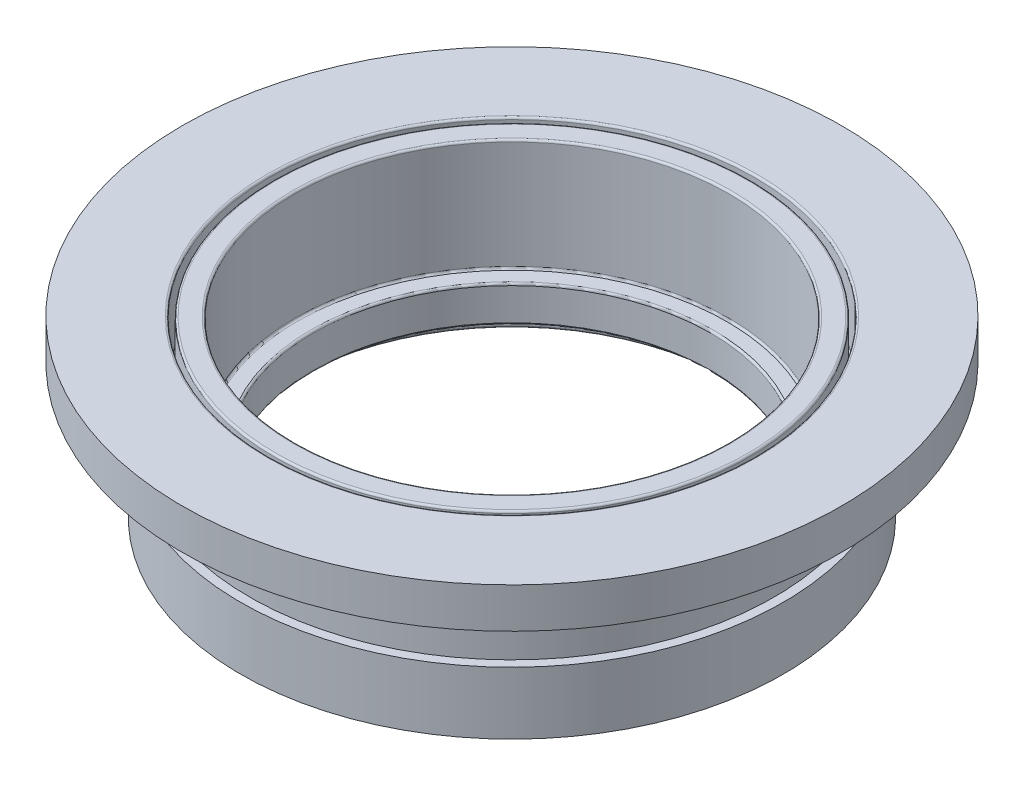
ISO-10303-21;
HEADER;
FILE_DESCRIPTION(('STEP AP214'),'2;1');
FILE_NAME('part.step','',(''),(''),'','','');
FILE_SCHEMA(('AUTOMOTIVE_DESIGN { 1 0 10303 214 1 1 1 1 }'));
ENDSEC;
DATA;
#1=APPLICATION_CONTEXT('core data for automotive mechanical design processes');
#2=APPLICATION_PROTOCOL_DEFINITION('international standard','automotive_design',2000,#1);
#3=PRODUCT_CONTEXT('',#1,'mechanical');
#4=PRODUCT('Part','Part','',(#3));
#5=PRODUCT_RELATED_PRODUCT_CATEGORY('part','',(#4));
#6=PRODUCT_DEFINITION_FORMATION('','',#4);
#7=PRODUCT_DEFINITION_CONTEXT('part definition',#1,'design');
#8=PRODUCT_DEFINITION('design','',#6,#7);
#9=PRODUCT_DEFINITION_SHAPE('','',#8);
#10=(LENGTH_UNIT() NAMED_UNIT(*) SI_UNIT(.MILLI.,.METRE.));
#11=(NAMED_UNIT(*) PLANE_ANGLE_UNIT() SI_UNIT($,.RADIAN.));
#12=(NAMED_UNIT(*) SI_UNIT($,.STERADIAN.) SOLID_ANGLE_UNIT());
#13=UNCERTAINTY_MEASURE_WITH_UNIT(LENGTH_MEASURE(1.E-05),#10,'distance_accuracy_value','');
#14=(GEOMETRIC_REPRESENTATION_CONTEXT(3) GLOBAL_UNCERTAINTY_ASSIGNED_CONTEXT((#13)) GLOBAL_UNIT_ASSIGNED_CONTEXT((#10,
#11,#12)) REPRESENTATION_CONTEXT('',''));
#15=CARTESIAN_POINT('',(0.,0.,0.));
#16=DIRECTION('',(0.,0.,1.));
#17=DIRECTION('',(1.,0.,0.));
#18=AXIS2_PLACEMENT_3D('',#15,#16,#17);
#19=CARTESIAN_POINT('',(27.,26.0880786991506,0.));
#20=DIRECTION('',(0.,1.,0.));
#21=DIRECTION('',(-1.,0.,0.));
#22=AXIS2_PLACEMENT_3D('',#19,#20,#21);
#23=PLANE('',#22);
#24=CARTESIAN_POINT('',(0.,26.0880786991506,0.));
#25=DIRECTION('',(0.,1.,0.));
#26=DIRECTION('',(-1.,0.,0.));
#27=AXIS2_PLACEMENT_3D('',#24,#25,#26);
#28=CIRCLE('',#27,27.);
#29=CARTESIAN_POINT('',(-27.,26.0880786991506,0.));
#30=VERTEX_POINT('',#29);
#31=EDGE_CURVE('E172',#30,#30,#28,.T.);
#32=ORIENTED_EDGE('',*,*,#31,.F.);
#33=EDGE_LOOP('',(#32));
#34=FACE_BOUND('',#33,.T.);
#35=CARTESIAN_POINT('',(0.,26.0880786991506,0.));
#36=DIRECTION('',(0.,1.,0.));
#37=DIRECTION('',(-1.,0.,0.));
#38=AXIS2_PLACEMENT_3D('',#35,#36,#37);
#39=CIRCLE('',#38,26.1);
#40=CARTESIAN_POINT('',(-26.1,26.0880786991506,0.));
#41=VERTEX_POINT('',#40);
#42=EDGE_CURVE('E10',#41,#41,#39,.T.);
#43=ORIENTED_EDGE('',*,*,#42,.T.);
#44=EDGE_LOOP('',(#43));
#45=FACE_BOUND('',#44,.T.);
#46=ADVANCED_FACE('F39',(#34,#45),#23,.F.);
#47=CARTESIAN_POINT('',(0.,34.,1.18710365520667E-13));
#48=DIRECTION('',(0.,1.,0.));
#49=DIRECTION('',(-1.,0.,0.));
#50=AXIS2_PLACEMENT_3D('',#47,#48,#49);
#51=CYLINDRICAL_SURFACE('',#50,26.1);
#52=ORIENTED_EDGE('',*,*,#42,.F.);
#53=EDGE_LOOP('',(#52));
#54=FACE_BOUND('',#53,.T.);
#55=CARTESIAN_POINT('',(0.,22.8880786991506,0.));
#56=DIRECTION('',(0.,1.,0.));
#57=DIRECTION('',(-1.,0.,0.));
#58=AXIS2_PLACEMENT_3D('',#55,#56,#57);
#59=CIRCLE('',#58,26.1);
#60=CARTESIAN_POINT('',(-26.1,22.8880786991506,0.));
#61=VERTEX_POINT('',#60);
#62=EDGE_CURVE('E45',#61,#61,#59,.T.);
#63=ORIENTED_EDGE('',*,*,#62,.T.);
#64=EDGE_LOOP('',(#63));
#65=FACE_BOUND('',#64,.T.);
#66=ADVANCED_FACE('F179',(#54,#65),#51,.T.);
#67=CARTESIAN_POINT('',(26.1,22.8880786991506,0.));
#68=DIRECTION('',(0.,-1.,0.));
#69=DIRECTION('',(1.,0.,0.));
#70=AXIS2_PLACEMENT_3D('',#67,#68,#69);
#71=PLANE('',#70);
#72=ORIENTED_EDGE('',*,*,#62,.F.);
#73=EDGE_LOOP('',(#72));
#74=FACE_BOUND('',#73,.T.);
#75=CARTESIAN_POINT('',(0.,22.8880786991506,0.));
#76=DIRECTION('',(0.,1.,0.));
#77=DIRECTION('',(-1.,0.,0.));
#78=AXIS2_PLACEMENT_3D('',#75,#76,#77);
#79=CIRCLE('',#78,27.);
#80=CARTESIAN_POINT('',(-27.,22.8880786991506,0.));
#81=VERTEX_POINT('',#80);
#82=EDGE_CURVE('E49',#81,#81,#79,.T.);
#83=ORIENTED_EDGE('',*,*,#82,.T.);
#84=EDGE_LOOP('',(#83));
#85=FACE_BOUND('',#84,.T.);
#86=ADVANCED_FACE('F183',(#74,#85),#71,.F.);
#87=CARTESIAN_POINT('',(0.,34.,1.18710365520667E-13));
#88=DIRECTION('',(0.,1.,0.));
#89=DIRECTION('',(-1.,0.,0.));
#90=AXIS2_PLACEMENT_3D('',#87,#88,#89);
#91=CYLINDRICAL_SURFACE('',#90,27.);
#92=ORIENTED_EDGE('',*,*,#82,.F.);
#93=EDGE_LOOP('',(#92));
#94=FACE_BOUND('',#93,.T.);
#95=CARTESIAN_POINT('',(0.,16.6880786991506,0.));
#96=DIRECTION('',(0.,1.,0.));
#97=DIRECTION('',(-1.,0.,0.));
#98=AXIS2_PLACEMENT_3D('',#95,#96,#97);
#99=CIRCLE('',#98,27.);
#100=CARTESIAN_POINT('',(-27.,16.6880786991506,0.));
#101=VERTEX_POINT('',#100);
#102=EDGE_CURVE('E53',#101,#101,#99,.T.);
#103=ORIENTED_EDGE('',*,*,#102,.T.);
#104=EDGE_LOOP('',(#103));
#105=FACE_BOUND('',#104,.T.);
#106=ADVANCED_FACE('F188',(#94,#105),#91,.T.);
#107=CARTESIAN_POINT('',(25.2,16.6880786991506,0.));
#108=DIRECTION('',(0.,1.,0.));
#109=DIRECTION('',(-1.,0.,0.));
#110=AXIS2_PLACEMENT_3D('',#107,#108,#109);
#111=PLANE('',#110);
#112=ORIENTED_EDGE('',*,*,#102,.F.);
#113=EDGE_LOOP('',(#112));
#114=FACE_BOUND('',#113,.T.);
#115=CARTESIAN_POINT('',(0.,16.6880786991506,0.));
#116=DIRECTION('',(0.,1.,0.));
#117=DIRECTION('',(-1.,0.,0.));
#118=AXIS2_PLACEMENT_3D('',#115,#116,#117);
#119=CIRCLE('',#118,25.2);
#120=CARTESIAN_POINT('',(-25.2,16.6880786991506,0.));
#121=VERTEX_POINT('',#120);
#122=EDGE_CURVE('E58',#121,#121,#119,.T.);
#123=ORIENTED_EDGE('',*,*,#122,.T.);
#124=EDGE_LOOP('',(#123));
#125=FACE_BOUND('',#124,.T.);
#126=ADVANCED_FACE('F194',(#114,#125),#111,.F.);
#127=CARTESIAN_POINT('',(0.,34.,1.18710365520667E-13));
#128=DIRECTION('',(0.,1.,0.));
#129=DIRECTION('',(-1.,0.,0.));
#130=AXIS2_PLACEMENT_3D('',#127,#128,#129);
#131=CYLINDRICAL_SURFACE('',#130,25.2);
#132=ORIENTED_EDGE('',*,*,#122,.F.);
#133=EDGE_LOOP('',(#132));
#134=FACE_BOUND('',#133,.T.);
#135=CARTESIAN_POINT('',(0.,32.6553787038106,1.1401564535721E-13));
#136=DIRECTION('',(0.,1.,0.));
#137=DIRECTION('',(-1.,0.,0.));
#138=AXIS2_PLACEMENT_3D('',#135,#136,#137);
#139=CIRCLE('',#138,25.2);
#140=CARTESIAN_POINT('',(-25.2,32.6553787038106,1.13975798249497E-13));
#141=VERTEX_POINT('',#140);
#142=EDGE_CURVE('E61',#141,#141,#139,.T.);
#143=ORIENTED_EDGE('',*,*,#142,.T.);
#144=EDGE_LOOP('',(#143));
#145=FACE_BOUND('',#144,.T.);
#146=ADVANCED_FACE('F198',(#134,#145),#131,.F.);
#147=CARTESIAN_POINT('',(0.,32.6553787038106,1.1401564535721E-13));
#148=DIRECTION('',(0.,1.,0.));
#149=DIRECTION('',(-1.,0.,0.));
#150=AXIS2_PLACEMENT_3D('',#147,#148,#149);
#151=TOROIDAL_SURFACE('',#150,25.,0.199999999999997);
#152=ORIENTED_EDGE('',*,*,#142,.F.);
#153=EDGE_LOOP('',(#152));
#154=FACE_BOUND('',#153,.T.);
#155=CARTESIAN_POINT('',(0.,32.8553787038106,1.14713941624979E-13));
#156=DIRECTION('',(0.,1.,0.));
#157=DIRECTION('',(-1.,0.,0.));
#158=AXIS2_PLACEMENT_3D('',#155,#156,#157);
#159=CIRCLE('',#158,25.);
#160=CARTESIAN_POINT('',(-25.,32.8553787038106,1.14674410764153E-13));
#161=VERTEX_POINT('',#160);
#162=EDGE_CURVE('E64',#161,#161,#159,.T.);
#163=ORIENTED_EDGE('',*,*,#162,.T.);
#164=EDGE_LOOP('',(#163));
#165=FACE_BOUND('',#164,.T.);
#166=ADVANCED_FACE('F202',(#154,#165),#151,.F.);
#167=CARTESIAN_POINT('',(24.9,32.8553787038106,1.14753314362362E-13));
#168=DIRECTION('',(0.,1.,0.));
#169=DIRECTION('',(-1.,0.,0.));
#170=AXIS2_PLACEMENT_3D('',#167,#168,#169);
#171=PLANE('',#170);
#172=ORIENTED_EDGE('',*,*,#162,.F.);
#173=EDGE_LOOP('',(#172));
#174=FACE_BOUND('',#173,.T.);
#175=CARTESIAN_POINT('',(0.,32.8553787038106,1.14713941624979E-13));
#176=DIRECTION('',(0.,1.,0.));
#177=DIRECTION('',(-1.,0.,0.));
#178=AXIS2_PLACEMENT_3D('',#175,#176,#177);
#179=CIRCLE('',#178,24.9);
#180=CARTESIAN_POINT('',(-24.9,32.8553787038106,1.14674568887596E-13));
#181=VERTEX_POINT('',#180);
#182=EDGE_CURVE('E67',#181,#181,#179,.T.);
#183=ORIENTED_EDGE('',*,*,#182,.T.);
#184=EDGE_LOOP('',(#183));
#185=FACE_BOUND('',#184,.T.);
#186=ADVANCED_FACE('F206',(#174,#185),#171,.F.);
#187=CARTESIAN_POINT('',(0.,32.6553787038106,1.1401564535721E-13));
#188=DIRECTION('',(0.,1.,0.));
#189=DIRECTION('',(-1.,0.,0.));
#190=AXIS2_PLACEMENT_3D('',#187,#188,#189);
#191=TOROIDAL_SURFACE('',#190,24.9,0.199999999999999);
#192=ORIENTED_EDGE('',*,*,#182,.F.);
#193=EDGE_LOOP('',(#192));
#194=FACE_BOUND('',#193,.T.);
#195=CARTESIAN_POINT('',(0.,32.6553787038106,1.1401564535721E-13));
#196=DIRECTION('',(0.,1.,0.));
#197=DIRECTION('',(-1.,0.,0.));
#198=AXIS2_PLACEMENT_3D('',#195,#196,#197);
#199=CIRCLE('',#198,24.7);
#200=CARTESIAN_POINT('',(-24.7,32.6553787038106,1.13976588866714E-13));
#201=VERTEX_POINT('',#200);
#202=EDGE_CURVE('E70',#201,#201,#199,.T.);
#203=ORIENTED_EDGE('',*,*,#202,.T.);
#204=EDGE_LOOP('',(#203));
#205=FACE_BOUND('',#204,.T.);
#206=ADVANCED_FACE('F210',(#194,#205),#191,.F.);
#207=CARTESIAN_POINT('',(0.,34.,1.18710365520667E-13));
#208=DIRECTION('',(0.,1.,0.));
#209=DIRECTION('',(-1.,0.,0.));
#210=AXIS2_PLACEMENT_3D('',#207,#208,#209);
#211=CYLINDRICAL_SURFACE('',#210,24.7);
#212=ORIENTED_EDGE('',*,*,#202,.F.);
#213=EDGE_LOOP('',(#212));
#214=FACE_BOUND('',#213,.T.);
#215=CARTESIAN_POINT('',(0.,27.6553787038106,0.));
#216=DIRECTION('',(0.,1.,0.));
#217=DIRECTION('',(-1.,0.,0.));
#218=AXIS2_PLACEMENT_3D('',#215,#216,#217);
#219=CIRCLE('',#218,24.7);
#220=CARTESIAN_POINT('',(-24.7,27.6553787038106,0.));
#221=VERTEX_POINT('',#220);
#222=EDGE_CURVE('E73',#221,#221,#219,.T.);
#223=ORIENTED_EDGE('',*,*,#222,.T.);
#224=EDGE_LOOP('',(#223));
#225=FACE_BOUND('',#224,.T.);
#226=ADVANCED_FACE('F214',(#214,#225),#211,.T.);
#227=CARTESIAN_POINT('',(0.,27.6553787038106,0.));
#228=DIRECTION('',(0.,1.,0.));
#229=DIRECTION('',(-1.,0.,0.));
#230=AXIS2_PLACEMENT_3D('',#227,#228,#229);
#231=TOROIDAL_SURFACE('',#230,24.5,0.199999999999999);
#232=ORIENTED_EDGE('',*,*,#222,.F.);
#233=EDGE_LOOP('',(#232));
#234=FACE_BOUND('',#233,.T.);
#235=CARTESIAN_POINT('',(0.,27.4553787038106,0.));
#236=DIRECTION('',(0.,1.,0.));
#237=DIRECTION('',(-1.,0.,0.));
#238=AXIS2_PLACEMENT_3D('',#235,#236,#237);
#239=CIRCLE('',#238,24.5);
#240=CARTESIAN_POINT('',(-24.5,27.4553787038106,0.));
#241=VERTEX_POINT('',#240);
#242=EDGE_CURVE('E76',#241,#241,#239,.T.);
#243=ORIENTED_EDGE('',*,*,#242,.T.);
#244=EDGE_LOOP('',(#243));
#245=FACE_BOUND('',#244,.T.);
#246=ADVANCED_FACE('F218',(#234,#245),#231,.T.);
#247=CARTESIAN_POINT('',(24.5,27.4553787038106,0.));
#248=DIRECTION('',(0.,1.,0.));
#249=DIRECTION('',(-1.,0.,0.));
#250=AXIS2_PLACEMENT_3D('',#247,#248,#249);
#251=PLANE('',#250);
#252=ORIENTED_EDGE('',*,*,#242,.F.);
#253=EDGE_LOOP('',(#252));
#254=FACE_BOUND('',#253,.T.);
#255=CARTESIAN_POINT('',(0.,27.4553787038106,0.));
#256=DIRECTION('',(0.,1.,0.));
#257=DIRECTION('',(-1.,0.,0.));
#258=AXIS2_PLACEMENT_3D('',#255,#256,#257);
#259=CIRCLE('',#258,23.4);
#260=CARTESIAN_POINT('',(-23.4,27.4553787038106,0.));
#261=VERTEX_POINT('',#260);
#262=EDGE_CURVE('E79',#261,#261,#259,.T.);
#263=ORIENTED_EDGE('',*,*,#262,.T.);
#264=EDGE_LOOP('',(#263));
#265=FACE_BOUND('',#264,.T.);
#266=ADVANCED_FACE('F222',(#254,#265),#251,.F.);
#267=CARTESIAN_POINT('',(0.,27.6553787038106,0.));
#268=DIRECTION('',(0.,1.,0.));
#269=DIRECTION('',(-1.,0.,0.));
#270=AXIS2_PLACEMENT_3D('',#267,#268,#269);
#271=TOROIDAL_SURFACE('',#270,23.4,0.199999999999997);
#272=ORIENTED_EDGE('',*,*,#262,.F.);
#273=EDGE_LOOP('',(#272));
#274=FACE_BOUND('',#273,.T.);
#275=CARTESIAN_POINT('',(0.,27.6553787038106,0.));
#276=DIRECTION('',(0.,1.,0.));
#277=DIRECTION('',(-1.,0.,0.));
#278=AXIS2_PLACEMENT_3D('',#275,#276,#277);
#279=CIRCLE('',#278,23.2);
#280=CARTESIAN_POINT('',(-23.2,27.6553787038106,0.));
#281=VERTEX_POINT('',#280);
#282=EDGE_CURVE('E82',#281,#281,#279,.T.);
#283=ORIENTED_EDGE('',*,*,#282,.T.);
#284=EDGE_LOOP('',(#283));
#285=FACE_BOUND('',#284,.T.);
#286=ADVANCED_FACE('F226',(#274,#285),#271,.T.);
#287=CARTESIAN_POINT('',(0.,34.,1.18710365520667E-13));
#288=DIRECTION('',(0.,1.,0.));
#289=DIRECTION('',(-1.,0.,0.));
#290=AXIS2_PLACEMENT_3D('',#287,#288,#289);
#291=CYLINDRICAL_SURFACE('',#290,23.2);
#292=ORIENTED_EDGE('',*,*,#282,.F.);
#293=EDGE_LOOP('',(#292));
#294=FACE_BOUND('',#293,.T.);
#295=CARTESIAN_POINT('',(0.,32.6553787038106,1.1401564535721E-13));
#296=DIRECTION('',(0.,1.,0.));
#297=DIRECTION('',(-1.,0.,0.));
#298=AXIS2_PLACEMENT_3D('',#295,#296,#297);
#299=CIRCLE('',#298,23.2);
#300=CARTESIAN_POINT('',(-23.2,32.6553787038106,1.13978960718364E-13));
#301=VERTEX_POINT('',#300);
#302=EDGE_CURVE('E85',#301,#301,#299,.T.);
#303=ORIENTED_EDGE('',*,*,#302,.T.);
#304=EDGE_LOOP('',(#303));
#305=FACE_BOUND('',#304,.T.);
#306=ADVANCED_FACE('F230',(#294,#305),#291,.F.);
#307=CARTESIAN_POINT('',(0.,32.6553787038106,1.1401564535721E-13));
#308=DIRECTION('',(0.,1.,0.));
#309=DIRECTION('',(-1.,0.,0.));
#310=AXIS2_PLACEMENT_3D('',#307,#308,#309);
#311=TOROIDAL_SURFACE('',#310,23.,0.199999999999995);
#312=ORIENTED_EDGE('',*,*,#302,.F.);
#313=EDGE_LOOP('',(#312));
#314=FACE_BOUND('',#313,.T.);
#315=CARTESIAN_POINT('',(0.,32.8553787038106,1.14713941624979E-13));
#316=DIRECTION('',(0.,1.,0.));
#317=DIRECTION('',(-1.,0.,0.));
#318=AXIS2_PLACEMENT_3D('',#315,#316,#317);
#319=CIRCLE('',#318,23.);
#320=CARTESIAN_POINT('',(-23.,32.8553787038106,1.14677573233019E-13));
#321=VERTEX_POINT('',#320);
#322=EDGE_CURVE('E88',#321,#321,#319,.T.);
#323=ORIENTED_EDGE('',*,*,#322,.T.);
#324=EDGE_LOOP('',(#323));
#325=FACE_BOUND('',#324,.T.);
#326=ADVANCED_FACE('F234',(#314,#325),#311,.F.);
#327=CARTESIAN_POINT('',(23.,32.8553787038106,1.14750310016939E-13));
#328=DIRECTION('',(0.,1.,0.));
#329=DIRECTION('',(-1.,0.,0.));
#330=AXIS2_PLACEMENT_3D('',#327,#328,#329);
#331=PLANE('',#330);
#332=ORIENTED_EDGE('',*,*,#322,.F.);
#333=EDGE_LOOP('',(#332));
#334=FACE_BOUND('',#333,.T.);
#335=CARTESIAN_POINT('',(0.,32.8553787038106,1.14713941624979E-13));
#336=DIRECTION('',(0.,1.,0.));
#337=DIRECTION('',(-1.,0.,0.));
#338=AXIS2_PLACEMENT_3D('',#335,#336,#337);
#339=CIRCLE('',#338,22.9);
#340=CARTESIAN_POINT('',(-22.9,32.8553787038106,1.14677731356462E-13));
#341=VERTEX_POINT('',#340);
#342=EDGE_CURVE('E91',#341,#341,#339,.T.);
#343=ORIENTED_EDGE('',*,*,#342,.T.);
#344=EDGE_LOOP('',(#343));
#345=FACE_BOUND('',#344,.T.);
#346=ADVANCED_FACE('F238',(#334,#345),#331,.F.);
#347=CARTESIAN_POINT('',(0.,32.6553787038106,1.1401564535721E-13));
#348=DIRECTION('',(0.,1.,0.));
#349=DIRECTION('',(-1.,0.,0.));
#350=AXIS2_PLACEMENT_3D('',#347,#348,#349);
#351=TOROIDAL_SURFACE('',#350,22.9,0.199999999999999);
#352=ORIENTED_EDGE('',*,*,#342,.F.);
#353=EDGE_LOOP('',(#352));
#354=FACE_BOUND('',#353,.T.);
#355=CARTESIAN_POINT('',(0.,32.6553787038106,1.1401564535721E-13));
#356=DIRECTION('',(0.,1.,0.));
#357=DIRECTION('',(-1.,0.,0.));
#358=AXIS2_PLACEMENT_3D('',#355,#356,#357);
#359=CIRCLE('',#358,22.7);
#360=CARTESIAN_POINT('',(-22.7,32.6553787038106,1.1397975133558E-13));
#361=VERTEX_POINT('',#360);
#362=EDGE_CURVE('E94',#361,#361,#359,.T.);
#363=ORIENTED_EDGE('',*,*,#362,.T.);
#364=EDGE_LOOP('',(#363));
#365=FACE_BOUND('',#364,.T.);
#366=ADVANCED_FACE('F242',(#354,#365),#351,.F.);
#367=CARTESIAN_POINT('',(0.,34.,1.18710365520667E-13));
#368=DIRECTION('',(0.,1.,0.));
#369=DIRECTION('',(-1.,0.,0.));
#370=AXIS2_PLACEMENT_3D('',#367,#368,#369);
#371=CYLINDRICAL_SURFACE('',#370,22.7);
#372=ORIENTED_EDGE('',*,*,#362,.F.);
#373=EDGE_LOOP('',(#372));
#374=FACE_BOUND('',#373,.T.);
#375=CARTESIAN_POINT('',(0.,17.9593775854305,0.));
#376=DIRECTION('',(0.,1.,0.));
#377=DIRECTION('',(-1.,0.,0.));
#378=AXIS2_PLACEMENT_3D('',#375,#376,#377);
#379=CIRCLE('',#378,22.7);
#380=CARTESIAN_POINT('',(-22.7,17.9593775854305,0.));
#381=VERTEX_POINT('',#380);
#382=EDGE_CURVE('E97',#381,#381,#379,.T.);
#383=ORIENTED_EDGE('',*,*,#382,.T.);
#384=EDGE_LOOP('',(#383));
#385=FACE_BOUND('',#384,.T.);
#386=ADVANCED_FACE('F246',(#374,#385),#371,.T.);
#387=CARTESIAN_POINT('',(0.,17.9593775854305,0.));
#388=DIRECTION('',(0.,1.,0.));
#389=DIRECTION('',(-1.,0.,0.));
#390=AXIS2_PLACEMENT_3D('',#387,#388,#389);
#391=TOROIDAL_SURFACE('',#390,22.5,0.200000000000001);
#392=ORIENTED_EDGE('',*,*,#382,.F.);
#393=EDGE_LOOP('',(#392));
#394=FACE_BOUND('',#393,.T.);
#395=CARTESIAN_POINT('',(0.,17.7593775854305,0.));
#396=DIRECTION('',(0.,1.,0.));
#397=DIRECTION('',(-1.,0.,0.));
#398=AXIS2_PLACEMENT_3D('',#395,#396,#397);
#399=CIRCLE('',#398,22.5);
#400=CARTESIAN_POINT('',(-22.5,17.7593775854305,0.));
#401=VERTEX_POINT('',#400);
#402=EDGE_CURVE('E100',#401,#401,#399,.T.);
#403=ORIENTED_EDGE('',*,*,#402,.T.);
#404=EDGE_LOOP('',(#403));
#405=FACE_BOUND('',#404,.T.);
#406=ADVANCED_FACE('F250',(#394,#405),#391,.T.);
#407=CARTESIAN_POINT('',(21.8,17.7593775854305,0.));
#408=DIRECTION('',(0.,1.,0.));
#409=DIRECTION('',(-1.,0.,0.));
#410=AXIS2_PLACEMENT_3D('',#407,#408,#409);
#411=PLANE('',#410);
#412=ORIENTED_EDGE('',*,*,#402,.F.);
#413=EDGE_LOOP('',(#412));
#414=FACE_BOUND('',#413,.T.);
#415=CARTESIAN_POINT('',(0.,17.7593775854305,0.));
#416=DIRECTION('',(0.,1.,0.));
#417=DIRECTION('',(-1.,0.,0.));
#418=AXIS2_PLACEMENT_3D('',#415,#416,#417);
#419=CIRCLE('',#418,21.8);
#420=CARTESIAN_POINT('',(-21.8,17.7593775854305,0.));
#421=VERTEX_POINT('',#420);
#422=EDGE_CURVE('E103',#421,#421,#419,.T.);
#423=ORIENTED_EDGE('',*,*,#422,.T.);
#424=EDGE_LOOP('',(#423));
#425=FACE_BOUND('',#424,.T.);
#426=ADVANCED_FACE('F254',(#414,#425),#411,.F.);
#427=CARTESIAN_POINT('',(0.,17.9593775854305,0.));
#428=DIRECTION('',(0.,1.,0.));
#429=DIRECTION('',(-1.,0.,0.));
#430=AXIS2_PLACEMENT_3D('',#427,#428,#429);
#431=TOROIDAL_SURFACE('',#430,21.8,0.200000000000001);
#432=ORIENTED_EDGE('',*,*,#422,.F.);
#433=EDGE_LOOP('',(#432));
#434=FACE_BOUND('',#433,.T.);
#435=CARTESIAN_POINT('',(0.,17.9593775854305,0.));
#436=DIRECTION('',(0.,1.,0.));
#437=DIRECTION('',(-1.,0.,0.));
#438=AXIS2_PLACEMENT_3D('',#435,#436,#437);
#439=CIRCLE('',#438,21.6);
#440=CARTESIAN_POINT('',(-21.6,17.9593775854305,0.));
#441=VERTEX_POINT('',#440);
#442=EDGE_CURVE('E106',#441,#441,#439,.T.);
#443=ORIENTED_EDGE('',*,*,#442,.T.);
#444=EDGE_LOOP('',(#443));
#445=FACE_BOUND('',#444,.T.);
#446=ADVANCED_FACE('F258',(#434,#445),#431,.T.);
#447=CARTESIAN_POINT('',(0.,34.,1.18710365520667E-13));
#448=DIRECTION('',(0.,1.,0.));
#449=DIRECTION('',(-1.,0.,0.));
#450=AXIS2_PLACEMENT_3D('',#447,#448,#449);
#451=CYLINDRICAL_SURFACE('',#450,21.6);
#452=ORIENTED_EDGE('',*,*,#442,.F.);
#453=EDGE_LOOP('',(#452));
#454=FACE_BOUND('',#453,.T.);
#455=CARTESIAN_POINT('',(0.,19.0880786991506,0.));
#456=DIRECTION('',(0.,1.,0.));
#457=DIRECTION('',(-1.,0.,0.));
#458=AXIS2_PLACEMENT_3D('',#455,#456,#457);
#459=CIRCLE('',#458,21.6);
#460=CARTESIAN_POINT('',(-21.6,19.0880786991506,0.));
#461=VERTEX_POINT('',#460);
#462=EDGE_CURVE('E109',#461,#461,#459,.T.);
#463=ORIENTED_EDGE('',*,*,#462,.T.);
#464=EDGE_LOOP('',(#463));
#465=FACE_BOUND('',#464,.T.);
#466=ADVANCED_FACE('F262',(#454,#465),#451,.F.);
#467=CARTESIAN_POINT('',(0.,19.0880786991506,0.));
#468=DIRECTION('',(0.,1.,0.));
#469=DIRECTION('',(-1.,0.,0.));
#470=AXIS2_PLACEMENT_3D('',#467,#468,#469);
#471=TOROIDAL_SURFACE('',#470,21.4,0.199999999999999);
#472=ORIENTED_EDGE('',*,*,#462,.F.);
#473=EDGE_LOOP('',(#472));
#474=FACE_BOUND('',#473,.T.);
#475=CARTESIAN_POINT('',(0.,19.2880786991506,0.));
#476=DIRECTION('',(0.,1.,0.));
#477=DIRECTION('',(-1.,0.,0.));
#478=AXIS2_PLACEMENT_3D('',#475,#476,#477);
#479=CIRCLE('',#478,21.4);
#480=CARTESIAN_POINT('',(-21.4,19.2880786991506,0.));
#481=VERTEX_POINT('',#480);
#482=EDGE_CURVE('E112',#481,#481,#479,.T.);
#483=ORIENTED_EDGE('',*,*,#482,.T.);
#484=EDGE_LOOP('',(#483));
#485=FACE_BOUND('',#484,.T.);
#486=ADVANCED_FACE('F266',(#474,#485),#471,.F.);
#487=CARTESIAN_POINT('',(20.,19.2880786991506,0.));
#488=DIRECTION('',(0.,1.,0.));
#489=DIRECTION('',(-1.,0.,0.));
#490=AXIS2_PLACEMENT_3D('',#487,#488,#489);
#491=PLANE('',#490);
#492=ORIENTED_EDGE('',*,*,#482,.F.);
#493=EDGE_LOOP('',(#492));
#494=FACE_BOUND('',#493,.T.);
#495=CARTESIAN_POINT('',(0.,19.2880786991506,0.));
#496=DIRECTION('',(0.,1.,0.));
#497=DIRECTION('',(-1.,0.,0.));
#498=AXIS2_PLACEMENT_3D('',#495,#496,#497);
#499=CIRCLE('',#498,20.);
#500=CARTESIAN_POINT('',(-20.,19.2880786991506,0.));
#501=VERTEX_POINT('',#500);
#502=EDGE_CURVE('E115',#501,#501,#499,.T.);
#503=ORIENTED_EDGE('',*,*,#502,.T.);
#504=EDGE_LOOP('',(#503));
#505=FACE_BOUND('',#504,.T.);
#506=ADVANCED_FACE('F270',(#494,#505),#491,.F.);
#507=CARTESIAN_POINT('',(0.,19.4880786991506,0.));
#508=DIRECTION('',(0.,1.,0.));
#509=DIRECTION('',(-1.,0.,0.));
#510=AXIS2_PLACEMENT_3D('',#507,#508,#509);
#511=TOROIDAL_SURFACE('',#510,20.,0.200000000000001);
#512=ORIENTED_EDGE('',*,*,#502,.F.);
#513=EDGE_LOOP('',(#512));
#514=FACE_BOUND('',#513,.T.);
#515=CARTESIAN_POINT('',(0.,19.4880786991506,0.));
#516=DIRECTION('',(0.,1.,0.));
#517=DIRECTION('',(-1.,0.,0.));
#518=AXIS2_PLACEMENT_3D('',#515,#516,#517);
#519=CIRCLE('',#518,19.8);
#520=CARTESIAN_POINT('',(-19.8,19.4880786991506,0.));
#521=VERTEX_POINT('',#520);
#522=EDGE_CURVE('E118',#521,#521,#519,.T.);
#523=ORIENTED_EDGE('',*,*,#522,.T.);
#524=EDGE_LOOP('',(#523));
#525=FACE_BOUND('',#524,.T.);
#526=ADVANCED_FACE('F274',(#514,#525),#511,.T.);
#527=CARTESIAN_POINT('',(0.,34.,1.18710365520667E-13));
#528=DIRECTION('',(0.,1.,0.));
#529=DIRECTION('',(-1.,0.,0.));
#530=AXIS2_PLACEMENT_3D('',#527,#528,#529);
#531=CYLINDRICAL_SURFACE('',#530,19.8);
#532=ORIENTED_EDGE('',*,*,#522,.F.);
#533=EDGE_LOOP('',(#532));
#534=FACE_BOUND('',#533,.T.);
#535=CARTESIAN_POINT('',(0.,22.6880786991506,0.));
#536=DIRECTION('',(0.,1.,0.));
#537=DIRECTION('',(-1.,0.,0.));
#538=AXIS2_PLACEMENT_3D('',#535,#536,#537);
#539=CIRCLE('',#538,19.8);
#540=CARTESIAN_POINT('',(-19.8,22.6880786991506,0.));
#541=VERTEX_POINT('',#540);
#542=EDGE_CURVE('E121',#541,#541,#539,.T.);
#543=ORIENTED_EDGE('',*,*,#542,.T.);
#544=EDGE_LOOP('',(#543));
#545=FACE_BOUND('',#544,.T.);
#546=ADVANCED_FACE('F278',(#534,#545),#531,.F.);
#547=CARTESIAN_POINT('',(0.,22.6880786991506,0.));
#548=DIRECTION('',(0.,1.,0.));
#549=DIRECTION('',(-1.,0.,0.));
#550=AXIS2_PLACEMENT_3D('',#547,#548,#549);
#551=TOROIDAL_SURFACE('',#550,20.,0.200000000000001);
#552=ORIENTED_EDGE('',*,*,#542,.F.);
#553=EDGE_LOOP('',(#552));
#554=FACE_BOUND('',#553,.T.);
#555=CARTESIAN_POINT('',(0.,22.8880786991506,0.));
#556=DIRECTION('',(0.,1.,0.));
#557=DIRECTION('',(-1.,0.,0.));
#558=AXIS2_PLACEMENT_3D('',#555,#556,#557);
#559=CIRCLE('',#558,20.);
#560=CARTESIAN_POINT('',(-20.,22.8880786991506,0.));
#561=VERTEX_POINT('',#560);
#562=EDGE_CURVE('E124',#561,#561,#559,.T.);
#563=ORIENTED_EDGE('',*,*,#562,.T.);
#564=EDGE_LOOP('',(#563));
#565=FACE_BOUND('',#564,.T.);
#566=ADVANCED_FACE('F282',(#554,#565),#551,.T.);
#567=CARTESIAN_POINT('',(21.4,22.8880786991506,0.));
#568=DIRECTION('',(0.,-1.,0.));
#569=DIRECTION('',(1.,0.,0.));
#570=AXIS2_PLACEMENT_3D('',#567,#568,#569);
#571=PLANE('',#570);
#572=ORIENTED_EDGE('',*,*,#562,.F.);
#573=EDGE_LOOP('',(#572));
#574=FACE_BOUND('',#573,.T.);
#575=CARTESIAN_POINT('',(0.,22.8880786991506,0.));
#576=DIRECTION('',(0.,1.,0.));
#577=DIRECTION('',(-1.,0.,0.));
#578=AXIS2_PLACEMENT_3D('',#575,#576,#577);
#579=CIRCLE('',#578,21.4);
#580=CARTESIAN_POINT('',(-21.4,22.8880786991506,0.));
#581=VERTEX_POINT('',#580);
#582=EDGE_CURVE('E127',#581,#581,#579,.T.);
#583=ORIENTED_EDGE('',*,*,#582,.T.);
#584=EDGE_LOOP('',(#583));
#585=FACE_BOUND('',#584,.T.);
#586=ADVANCED_FACE('F286',(#574,#585),#571,.F.);
#587=CARTESIAN_POINT('',(0.,23.0880786991506,0.));
#588=DIRECTION('',(0.,1.,0.));
#589=DIRECTION('',(-1.,0.,0.));
#590=AXIS2_PLACEMENT_3D('',#587,#588,#589);
#591=TOROIDAL_SURFACE('',#590,21.4,0.200000000000001);
#592=ORIENTED_EDGE('',*,*,#582,.F.);
#593=EDGE_LOOP('',(#592));
#594=FACE_BOUND('',#593,.T.);
#595=CARTESIAN_POINT('',(0.,23.0880786991506,0.));
#596=DIRECTION('',(0.,1.,0.));
#597=DIRECTION('',(-1.,0.,0.));
#598=AXIS2_PLACEMENT_3D('',#595,#596,#597);
#599=CIRCLE('',#598,21.6);
#600=CARTESIAN_POINT('',(-21.6,23.0880786991506,0.));
#601=VERTEX_POINT('',#600);
#602=EDGE_CURVE('E130',#601,#601,#599,.T.);
#603=ORIENTED_EDGE('',*,*,#602,.T.);
#604=EDGE_LOOP('',(#603));
#605=FACE_BOUND('',#604,.T.);
#606=ADVANCED_FACE('F290',(#594,#605),#591,.F.);
#607=CARTESIAN_POINT('',(0.,34.,1.18710365520667E-13));
#608=DIRECTION('',(0.,1.,0.));
#609=DIRECTION('',(-1.,0.,0.));
#610=AXIS2_PLACEMENT_3D('',#607,#608,#609);
#611=CYLINDRICAL_SURFACE('',#610,21.6);
#612=ORIENTED_EDGE('',*,*,#602,.F.);
#613=EDGE_LOOP('',(#612));
#614=FACE_BOUND('',#613,.T.);
#615=CARTESIAN_POINT('',(0.,33.8,1.18012069252898E-13));
#616=DIRECTION('',(0.,1.,0.));
#617=DIRECTION('',(-1.,0.,0.));
#618=AXIS2_PLACEMENT_3D('',#615,#616,#617);
#619=CIRCLE('',#618,21.6);
#620=CARTESIAN_POINT('',(-21.6,33.8,1.17977914589144E-13));
#621=VERTEX_POINT('',#620);
#622=EDGE_CURVE('E133',#621,#621,#619,.T.);
#623=ORIENTED_EDGE('',*,*,#622,.T.);
#624=EDGE_LOOP('',(#623));
#625=FACE_BOUND('',#624,.T.);
#626=ADVANCED_FACE('F294',(#614,#625),#611,.F.);
#627=CARTESIAN_POINT('',(0.,33.8,1.18012069252898E-13));
#628=DIRECTION('',(0.,1.,0.));
#629=DIRECTION('',(-1.,0.,0.));
#630=AXIS2_PLACEMENT_3D('',#627,#628,#629);
#631=TOROIDAL_SURFACE('',#630,21.8,0.200000000000001);
#632=ORIENTED_EDGE('',*,*,#622,.F.);
#633=EDGE_LOOP('',(#632));
#634=FACE_BOUND('',#633,.T.);
#635=CARTESIAN_POINT('',(0.,34.,1.18710365520667E-13));
#636=DIRECTION('',(0.,1.,0.));
#637=DIRECTION('',(-1.,0.,0.));
#638=AXIS2_PLACEMENT_3D('',#635,#636,#637);
#639=CIRCLE('',#638,21.8);
#640=CARTESIAN_POINT('',(-21.8,34.,1.18675894610026E-13));
#641=VERTEX_POINT('',#640);
#642=EDGE_CURVE('E136',#641,#641,#639,.T.);
#643=ORIENTED_EDGE('',*,*,#642,.T.);
#644=EDGE_LOOP('',(#643));
#645=FACE_BOUND('',#644,.T.);
#646=ADVANCED_FACE('F298',(#634,#645),#631,.T.);
#647=CARTESIAN_POINT('',(22.5,34.,1.1874594329541E-13));
#648=DIRECTION('',(0.,-1.,0.));
#649=DIRECTION('',(1.,0.,0.));
#650=AXIS2_PLACEMENT_3D('',#647,#648,#649);
#651=PLANE('',#650);
#652=ORIENTED_EDGE('',*,*,#642,.F.);
#653=EDGE_LOOP('',(#652));
#654=FACE_BOUND('',#653,.T.);
#655=CARTESIAN_POINT('',(0.,34.,1.18710365520667E-13));
#656=DIRECTION('',(0.,1.,0.));
#657=DIRECTION('',(-1.,0.,0.));
#658=AXIS2_PLACEMENT_3D('',#655,#656,#657);
#659=CIRCLE('',#658,23.5);
#660=CARTESIAN_POINT('',(-23.5,34.,1.1867320651149E-13));
#661=VERTEX_POINT('',#660);
#662=EDGE_CURVE('E139',#661,#661,#659,.T.);
#663=ORIENTED_EDGE('',*,*,#662,.T.);
#664=EDGE_LOOP('',(#663));
#665=FACE_BOUND('',#664,.T.);
#666=ADVANCED_FACE('F302',(#654,#665),#651,.F.);
#667=CARTESIAN_POINT('',(0.,33.8,1.18012069252898E-13));
#668=DIRECTION('',(0.,1.,0.));
#669=DIRECTION('',(-1.,0.,0.));
#670=AXIS2_PLACEMENT_3D('',#667,#668,#669);
#671=TOROIDAL_SURFACE('',#670,23.5,0.199999999999997);
#672=ORIENTED_EDGE('',*,*,#662,.F.);
#673=EDGE_LOOP('',(#672));
#674=FACE_BOUND('',#673,.T.);
#675=CARTESIAN_POINT('',(0.,33.8,1.18012069252898E-13));
#676=DIRECTION('',(0.,1.,0.));
#677=DIRECTION('',(-1.,0.,0.));
#678=AXIS2_PLACEMENT_3D('',#675,#676,#677);
#679=CIRCLE('',#678,23.7);
#680=CARTESIAN_POINT('',(-23.7,33.8,1.17974593996835E-13));
#681=VERTEX_POINT('',#680);
#682=EDGE_CURVE('E142',#681,#681,#679,.T.);
#683=ORIENTED_EDGE('',*,*,#682,.T.);
#684=EDGE_LOOP('',(#683));
#685=FACE_BOUND('',#684,.T.);
#686=ADVANCED_FACE('F306',(#674,#685),#671,.T.);
#687=CARTESIAN_POINT('',(0.,34.,1.18710365520667E-13));
#688=DIRECTION('',(0.,1.,0.));
#689=DIRECTION('',(-1.,0.,0.));
#690=AXIS2_PLACEMENT_3D('',#687,#688,#689);
#691=CYLINDRICAL_SURFACE('',#690,23.7);
#692=ORIENTED_EDGE('',*,*,#682,.F.);
#693=EDGE_LOOP('',(#692));
#694=FACE_BOUND('',#693,.T.);
#695=CARTESIAN_POINT('',(0.,28.1553787038106,0.));
#696=DIRECTION('',(0.,1.,0.));
#697=DIRECTION('',(-1.,0.,0.));
#698=AXIS2_PLACEMENT_3D('',#695,#696,#697);
#699=CIRCLE('',#698,23.7);
#700=CARTESIAN_POINT('',(-23.7,28.1553787038106,0.));
#701=VERTEX_POINT('',#700);
#702=EDGE_CURVE('E145',#701,#701,#699,.T.);
#703=ORIENTED_EDGE('',*,*,#702,.T.);
#704=EDGE_LOOP('',(#703));
#705=FACE_BOUND('',#704,.T.);
#706=ADVANCED_FACE('F310',(#694,#705),#691,.T.);
#707=CARTESIAN_POINT('',(0.,28.1553787038106,0.));
#708=DIRECTION('',(0.,1.,0.));
#709=DIRECTION('',(-1.,0.,0.));
#710=AXIS2_PLACEMENT_3D('',#707,#708,#709);
#711=TOROIDAL_SURFACE('',#710,23.9,0.200000000000001);
#712=ORIENTED_EDGE('',*,*,#702,.F.);
#713=EDGE_LOOP('',(#712));
#714=FACE_BOUND('',#713,.T.);
#715=CARTESIAN_POINT('',(0.,27.9553787038106,0.));
#716=DIRECTION('',(0.,1.,0.));
#717=DIRECTION('',(-1.,0.,0.));
#718=AXIS2_PLACEMENT_3D('',#715,#716,#717);
#719=CIRCLE('',#718,23.9);
#720=CARTESIAN_POINT('',(-23.9,27.9553787038106,0.));
#721=VERTEX_POINT('',#720);
#722=EDGE_CURVE('E148',#721,#721,#719,.T.);
#723=ORIENTED_EDGE('',*,*,#722,.T.);
#724=EDGE_LOOP('',(#723));
#725=FACE_BOUND('',#724,.T.);
#726=ADVANCED_FACE('F314',(#714,#725),#711,.F.);
#727=CARTESIAN_POINT('',(23.9,27.9553787038106,0.));
#728=DIRECTION('',(0.,-1.,0.));
#729=DIRECTION('',(1.,0.,0.));
#730=AXIS2_PLACEMENT_3D('',#727,#728,#729);
#731=PLANE('',#730);
#732=ORIENTED_EDGE('',*,*,#722,.F.);
#733=EDGE_LOOP('',(#732));
#734=FACE_BOUND('',#733,.T.);
#735=CARTESIAN_POINT('',(0.,27.9553787038106,0.));
#736=DIRECTION('',(0.,1.,0.));
#737=DIRECTION('',(-1.,0.,0.));
#738=AXIS2_PLACEMENT_3D('',#735,#736,#737);
#739=CIRCLE('',#738,24.);
#740=CARTESIAN_POINT('',(-24.,27.9553787038106,0.));
#741=VERTEX_POINT('',#740);
#742=EDGE_CURVE('E151',#741,#741,#739,.T.);
#743=ORIENTED_EDGE('',*,*,#742,.T.);
#744=EDGE_LOOP('',(#743));
#745=FACE_BOUND('',#744,.T.);
#746=ADVANCED_FACE('F318',(#734,#745),#731,.F.);
#747=CARTESIAN_POINT('',(0.,28.1553787038106,0.));
#748=DIRECTION('',(0.,1.,0.));
#749=DIRECTION('',(-1.,0.,0.));
#750=AXIS2_PLACEMENT_3D('',#747,#748,#749);
#751=TOROIDAL_SURFACE('',#750,24.,0.200000000000002);
#752=ORIENTED_EDGE('',*,*,#742,.F.);
#753=EDGE_LOOP('',(#752));
#754=FACE_BOUND('',#753,.T.);
#755=CARTESIAN_POINT('',(0.,28.1553787038106,0.));
#756=DIRECTION('',(0.,1.,0.));
#757=DIRECTION('',(-1.,0.,0.));
#758=AXIS2_PLACEMENT_3D('',#755,#756,#757);
#759=CIRCLE('',#758,24.2);
#760=CARTESIAN_POINT('',(-24.2,28.1553787038106,0.));
#761=VERTEX_POINT('',#760);
#762=EDGE_CURVE('E154',#761,#761,#759,.T.);
#763=ORIENTED_EDGE('',*,*,#762,.T.);
#764=EDGE_LOOP('',(#763));
#765=FACE_BOUND('',#764,.T.);
#766=ADVANCED_FACE('F322',(#754,#765),#751,.F.);
#767=CARTESIAN_POINT('',(0.,34.,1.18710365520667E-13));
#768=DIRECTION('',(0.,1.,0.));
#769=DIRECTION('',(-1.,0.,0.));
#770=AXIS2_PLACEMENT_3D('',#767,#768,#769);
#771=CYLINDRICAL_SURFACE('',#770,24.2);
#772=ORIENTED_EDGE('',*,*,#762,.F.);
#773=EDGE_LOOP('',(#772));
#774=FACE_BOUND('',#773,.T.);
#775=CARTESIAN_POINT('',(0.,33.8880786991506,1.18319594387332E-13));
#776=DIRECTION('',(0.,1.,0.));
#777=DIRECTION('',(-1.,0.,0.));
#778=AXIS2_PLACEMENT_3D('',#775,#776,#777);
#779=CIRCLE('',#778,24.2);
#780=CARTESIAN_POINT('',(-24.2,33.8880786991506,1.18281328514052E-13));
#781=VERTEX_POINT('',#780);
#782=EDGE_CURVE('E157',#781,#781,#779,.T.);
#783=ORIENTED_EDGE('',*,*,#782,.T.);
#784=EDGE_LOOP('',(#783));
#785=FACE_BOUND('',#784,.T.);
#786=ADVANCED_FACE('F326',(#774,#785),#771,.F.);
#787=CARTESIAN_POINT('',(0.,33.8880786991506,1.18319594387332E-13));
#788=DIRECTION('',(0.,1.,0.));
#789=DIRECTION('',(-1.,0.,0.));
#790=AXIS2_PLACEMENT_3D('',#787,#788,#789);
#791=TOROIDAL_SURFACE('',#790,24.4,0.200000000000001);
#792=ORIENTED_EDGE('',*,*,#782,.F.);
#793=EDGE_LOOP('',(#792));
#794=FACE_BOUND('',#793,.T.);
#795=CARTESIAN_POINT('',(0.,34.0880786991506,1.190178906551E-13));
#796=DIRECTION('',(0.,1.,0.));
#797=DIRECTION('',(-1.,0.,0.));
#798=AXIS2_PLACEMENT_3D('',#795,#796,#797);
#799=CIRCLE('',#798,24.4);
#800=CARTESIAN_POINT('',(-24.4,34.0880786991506,1.18979308534934E-13));
#801=VERTEX_POINT('',#800);
#802=EDGE_CURVE('E160',#801,#801,#799,.T.);
#803=ORIENTED_EDGE('',*,*,#802,.T.);
#804=EDGE_LOOP('',(#803));
#805=FACE_BOUND('',#804,.T.);
#806=ADVANCED_FACE('F330',(#794,#805),#791,.T.);
#807=CARTESIAN_POINT('',(25.2,34.0880786991506,1.19057737762813E-13));
#808=DIRECTION('',(0.,-1.,0.));
#809=DIRECTION('',(1.,0.,0.));
#810=AXIS2_PLACEMENT_3D('',#807,#808,#809);
#811=PLANE('',#810);
#812=ORIENTED_EDGE('',*,*,#802,.F.);
#813=EDGE_LOOP('',(#812));
#814=FACE_BOUND('',#813,.T.);
#815=CARTESIAN_POINT('',(0.,34.0880786991506,1.190178906551E-13));
#816=DIRECTION('',(0.,1.,0.));
#817=DIRECTION('',(-1.,0.,0.));
#818=AXIS2_PLACEMENT_3D('',#815,#816,#817);
#819=CIRCLE('',#818,32.8);
#820=CARTESIAN_POINT('',(-32.8,34.0880786991506,1.18966026165696E-13));
#821=VERTEX_POINT('',#820);
#822=EDGE_CURVE('E163',#821,#821,#819,.T.);
#823=ORIENTED_EDGE('',*,*,#822,.T.);
#824=EDGE_LOOP('',(#823));
#825=FACE_BOUND('',#824,.T.);
#826=ADVANCED_FACE('F334',(#814,#825),#811,.F.);
#827=CARTESIAN_POINT('',(0.,34.,1.18710365520667E-13));
#828=DIRECTION('',(0.,1.,0.));
#829=DIRECTION('',(-1.,0.,0.));
#830=AXIS2_PLACEMENT_3D('',#827,#828,#829);
#831=CYLINDRICAL_SURFACE('',#830,32.8);
#832=ORIENTED_EDGE('',*,*,#822,.F.);
#833=EDGE_LOOP('',(#832));
#834=FACE_BOUND('',#833,.T.);
#835=CARTESIAN_POINT('',(0.,30.0880786991506,1.05051965299728E-13));
#836=DIRECTION('',(0.,1.,0.));
#837=DIRECTION('',(-1.,0.,0.));
#838=AXIS2_PLACEMENT_3D('',#835,#836,#837);
#839=CIRCLE('',#838,32.8);
#840=CARTESIAN_POINT('',(-32.8,30.0880786991506,1.05000100810324E-13));
#841=VERTEX_POINT('',#840);
#842=EDGE_CURVE('E166',#841,#841,#839,.T.);
#843=ORIENTED_EDGE('',*,*,#842,.T.);
#844=EDGE_LOOP('',(#843));
#845=FACE_BOUND('',#844,.T.);
#846=ADVANCED_FACE('F338',(#834,#845),#831,.T.);
#847=CARTESIAN_POINT('',(27.,30.0880786991506,1.0509465862942E-13));
#848=DIRECTION('',(0.,1.,0.));
#849=DIRECTION('',(-1.,0.,0.));
#850=AXIS2_PLACEMENT_3D('',#847,#848,#849);
#851=PLANE('',#850);
#852=ORIENTED_EDGE('',*,*,#842,.F.);
#853=EDGE_LOOP('',(#852));
#854=FACE_BOUND('',#853,.T.);
#855=CARTESIAN_POINT('',(0.,30.0880786991506,1.05051965299728E-13));
#856=DIRECTION('',(0.,1.,0.));
#857=DIRECTION('',(-1.,0.,0.));
#858=AXIS2_PLACEMENT_3D('',#855,#856,#857);
#859=CIRCLE('',#858,27.);
#860=CARTESIAN_POINT('',(-27.,30.0880786991506,1.05009271970036E-13));
#861=VERTEX_POINT('',#860);
#862=EDGE_CURVE('E169',#861,#861,#859,.T.);
#863=ORIENTED_EDGE('',*,*,#862,.T.);
#864=EDGE_LOOP('',(#863));
#865=FACE_BOUND('',#864,.T.);
#866=ADVANCED_FACE('F342',(#854,#865),#851,.F.);
#867=CARTESIAN_POINT('',(0.,34.,1.18710365520667E-13));
#868=DIRECTION('',(0.,1.,0.));
#869=DIRECTION('',(-1.,0.,0.));
#870=AXIS2_PLACEMENT_3D('',#867,#868,#869);
#871=CYLINDRICAL_SURFACE('',#870,27.);
#872=ORIENTED_EDGE('',*,*,#862,.F.);
#873=EDGE_LOOP('',(#872));
#874=FACE_BOUND('',#873,.T.);
#875=ORIENTED_EDGE('',*,*,#31,.T.);
#876=EDGE_LOOP('',(#875));
#877=FACE_BOUND('',#876,.T.);
#878=ADVANCED_FACE('F176',(#874,#877),#871,.T.);
#879=CLOSED_SHELL('',(#46,#66,#86,#106,#126,#146,#166,#186,#206,#226,#246,#266,#286,#306,#326,
#346,#366,#386,#406,#426,#446,#466,#486,#506,#526,#546,#566,#586,#606,#626,#646,#666,#686,#706,
#726,#746,#766,#786,#806,#826,#846,#866,#878));
#880=MANIFOLD_SOLID_BREP('B2',#879);
#881=ADVANCED_BREP_SHAPE_REPRESENTATION('',(#18,#880),#14);
#882=SHAPE_DEFINITION_REPRESENTATION(#9,#881);
ENDSEC;
END-ISO-10303-21;
